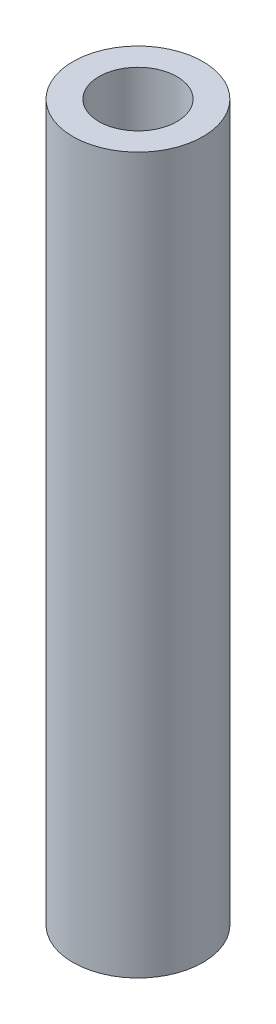
ISO-10303-21;
HEADER;
FILE_DESCRIPTION(('STEP AP214'),'2;1');
FILE_NAME('part.step','',(''),(''),'','','');
FILE_SCHEMA(('AUTOMOTIVE_DESIGN { 1 0 10303 214 1 1 1 1 }'));
ENDSEC;
DATA;
#1=APPLICATION_CONTEXT('core data for automotive mechanical design processes');
#2=APPLICATION_PROTOCOL_DEFINITION('international standard','automotive_design',2000,#1);
#3=PRODUCT_CONTEXT('',#1,'mechanical');
#4=PRODUCT('Part','Part','',(#3));
#5=PRODUCT_RELATED_PRODUCT_CATEGORY('part','',(#4));
#6=PRODUCT_DEFINITION_FORMATION('','',#4);
#7=PRODUCT_DEFINITION_CONTEXT('part definition',#1,'design');
#8=PRODUCT_DEFINITION('design','',#6,#7);
#9=PRODUCT_DEFINITION_SHAPE('','',#8);
#10=(LENGTH_UNIT() NAMED_UNIT(*) SI_UNIT(.MILLI.,.METRE.));
#11=(NAMED_UNIT(*) PLANE_ANGLE_UNIT() SI_UNIT($,.RADIAN.));
#12=(NAMED_UNIT(*) SI_UNIT($,.STERADIAN.) SOLID_ANGLE_UNIT());
#13=UNCERTAINTY_MEASURE_WITH_UNIT(LENGTH_MEASURE(1.E-05),#10,'distance_accuracy_value','');
#14=(GEOMETRIC_REPRESENTATION_CONTEXT(3) GLOBAL_UNCERTAINTY_ASSIGNED_CONTEXT((#13)) GLOBAL_UNIT_ASSIGNED_CONTEXT((#10,
#11,#12)) REPRESENTATION_CONTEXT('',''));
#15=CARTESIAN_POINT('',(0.,0.,0.));
#16=DIRECTION('',(0.,0.,1.));
#17=DIRECTION('',(1.,0.,0.));
#18=AXIS2_PLACEMENT_3D('',#15,#16,#17);
#19=CARTESIAN_POINT('',(0.,55.,0.));
#20=DIRECTION('',(0.,1.,0.));
#21=DIRECTION('',(0.,0.,1.));
#22=AXIS2_PLACEMENT_3D('',#19,#20,#21);
#23=PLANE('',#22);
#24=CARTESIAN_POINT('',(0.,55.,0.));
#25=DIRECTION('',(0.,1.,0.));
#26=DIRECTION('',(0.,0.,1.));
#27=AXIS2_PLACEMENT_3D('',#24,#25,#26);
#28=CIRCLE('',#27,5.);
#29=CARTESIAN_POINT('',(0.,55.,5.));
#30=VERTEX_POINT('',#29);
#31=EDGE_CURVE('E10',#30,#30,#28,.T.);
#32=ORIENTED_EDGE('',*,*,#31,.T.);
#33=EDGE_LOOP('',(#32));
#34=FACE_BOUND('',#33,.T.);
#35=CARTESIAN_POINT('',(0.,55.,0.));
#36=DIRECTION('',(0.,1.,0.));
#37=DIRECTION('',(0.,0.,1.));
#38=AXIS2_PLACEMENT_3D('',#35,#36,#37);
#39=CIRCLE('',#38,3.);
#40=CARTESIAN_POINT('',(0.,55.,3.));
#41=VERTEX_POINT('',#40);
#42=EDGE_CURVE('E42',#41,#41,#39,.T.);
#43=ORIENTED_EDGE('',*,*,#42,.F.);
#44=EDGE_LOOP('',(#43));
#45=FACE_BOUND('',#44,.T.);
#46=ADVANCED_FACE('F31',(#34,#45),#23,.T.);
#47=CARTESIAN_POINT('',(0.,0.,0.));
#48=DIRECTION('',(0.,1.,0.));
#49=DIRECTION('',(0.,0.,1.));
#50=AXIS2_PLACEMENT_3D('',#47,#48,#49);
#51=PLANE('',#50);
#52=CARTESIAN_POINT('',(0.,0.,0.));
#53=DIRECTION('',(0.,1.,0.));
#54=DIRECTION('',(0.,0.,1.));
#55=AXIS2_PLACEMENT_3D('',#52,#53,#54);
#56=CIRCLE('',#55,5.);
#57=CARTESIAN_POINT('',(0.,0.,5.));
#58=VERTEX_POINT('',#57);
#59=EDGE_CURVE('E35',#58,#58,#56,.T.);
#60=ORIENTED_EDGE('',*,*,#59,.F.);
#61=EDGE_LOOP('',(#60));
#62=FACE_BOUND('',#61,.T.);
#63=CARTESIAN_POINT('',(0.,0.,0.));
#64=DIRECTION('',(0.,1.,0.));
#65=DIRECTION('',(0.,0.,1.));
#66=AXIS2_PLACEMENT_3D('',#63,#64,#65);
#67=CIRCLE('',#66,3.);
#68=CARTESIAN_POINT('',(0.,0.,3.));
#69=VERTEX_POINT('',#68);
#70=EDGE_CURVE('E44',#69,#69,#67,.T.);
#71=ORIENTED_EDGE('',*,*,#70,.T.);
#72=EDGE_LOOP('',(#71));
#73=FACE_BOUND('',#72,.T.);
#74=ADVANCED_FACE('F54',(#62,#73),#51,.F.);
#75=CARTESIAN_POINT('',(0.,55.,0.));
#76=DIRECTION('',(0.,-1.,0.));
#77=DIRECTION('',(0.,0.,-1.));
#78=AXIS2_PLACEMENT_3D('',#75,#76,#77);
#79=CYLINDRICAL_SURFACE('',#78,5.);
#80=ORIENTED_EDGE('',*,*,#31,.F.);
#81=EDGE_LOOP('',(#80));
#82=FACE_BOUND('',#81,.T.);
#83=ORIENTED_EDGE('',*,*,#59,.T.);
#84=EDGE_LOOP('',(#83));
#85=FACE_BOUND('',#84,.T.);
#86=ADVANCED_FACE('F33',(#82,#85),#79,.T.);
#87=CARTESIAN_POINT('',(0.,55.,0.));
#88=DIRECTION('',(0.,-1.,0.));
#89=DIRECTION('',(0.,0.,-1.));
#90=AXIS2_PLACEMENT_3D('',#87,#88,#89);
#91=CYLINDRICAL_SURFACE('',#90,3.);
#92=ORIENTED_EDGE('',*,*,#42,.T.);
#93=EDGE_LOOP('',(#92));
#94=FACE_BOUND('',#93,.T.);
#95=ORIENTED_EDGE('',*,*,#70,.F.);
#96=EDGE_LOOP('',(#95));
#97=FACE_BOUND('',#96,.T.);
#98=ADVANCED_FACE('F50',(#94,#97),#91,.F.);
#99=CLOSED_SHELL('',(#46,#74,#86,#98));
#100=MANIFOLD_SOLID_BREP('B2',#99);
#101=ADVANCED_BREP_SHAPE_REPRESENTATION('',(#18,#100),#14);
#102=SHAPE_DEFINITION_REPRESENTATION(#9,#101);
ENDSEC;
END-ISO-10303-21;
